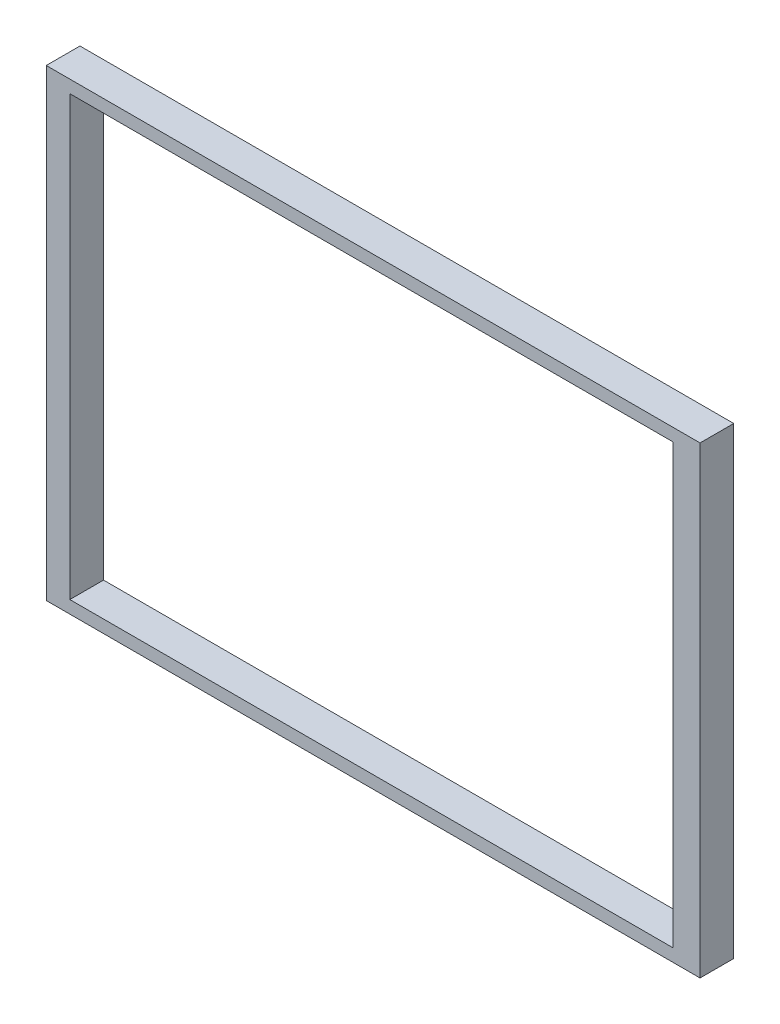
ISO-10303-21;
HEADER;
FILE_DESCRIPTION(('STEP AP214'),'2;1');
FILE_NAME('part.step','',(''),(''),'','','');
FILE_SCHEMA(('AUTOMOTIVE_DESIGN { 1 0 10303 214 1 1 1 1 }'));
ENDSEC;
DATA;
#1=APPLICATION_CONTEXT('core data for automotive mechanical design processes');
#2=APPLICATION_PROTOCOL_DEFINITION('international standard','automotive_design',2000,#1);
#3=PRODUCT_CONTEXT('',#1,'mechanical');
#4=PRODUCT('Part','Part','',(#3));
#5=PRODUCT_RELATED_PRODUCT_CATEGORY('part','',(#4));
#6=PRODUCT_DEFINITION_FORMATION('','',#4);
#7=PRODUCT_DEFINITION_CONTEXT('part definition',#1,'design');
#8=PRODUCT_DEFINITION('design','',#6,#7);
#9=PRODUCT_DEFINITION_SHAPE('','',#8);
#10=(LENGTH_UNIT() NAMED_UNIT(*) SI_UNIT(.MILLI.,.METRE.));
#11=(NAMED_UNIT(*) PLANE_ANGLE_UNIT() SI_UNIT($,.RADIAN.));
#12=(NAMED_UNIT(*) SI_UNIT($,.STERADIAN.) SOLID_ANGLE_UNIT());
#13=UNCERTAINTY_MEASURE_WITH_UNIT(LENGTH_MEASURE(1.E-05),#10,'distance_accuracy_value','');
#14=(GEOMETRIC_REPRESENTATION_CONTEXT(3) GLOBAL_UNCERTAINTY_ASSIGNED_CONTEXT((#13)) GLOBAL_UNIT_ASSIGNED_CONTEXT((#10,
#11,#12)) REPRESENTATION_CONTEXT('',''));
#15=CARTESIAN_POINT('',(0.,0.,0.));
#16=DIRECTION('',(0.,0.,1.));
#17=DIRECTION('',(1.,0.,0.));
#18=AXIS2_PLACEMENT_3D('',#15,#16,#17);
#19=CARTESIAN_POINT('',(0.,0.,4.));
#20=DIRECTION('',(0.,0.,1.));
#21=DIRECTION('',(1.,0.,0.));
#22=AXIS2_PLACEMENT_3D('',#19,#20,#21);
#23=PLANE('',#22);
#24=DIRECTION('',(0.,-1.,0.));
#25=VECTOR('',#24,1.);
#26=CARTESIAN_POINT('',(-37.7559939482542,31.8097014925373,4.));
#27=LINE('',#26,#25);
#28=CARTESIAN_POINT('',(-37.7559939482542,31.8097014925373,4.));
#29=VERTEX_POINT('',#28);
#30=CARTESIAN_POINT('',(-37.7559939482542,-23.1902985074627,4.));
#31=VERTEX_POINT('',#30);
#32=EDGE_CURVE('E157',#29,#31,#27,.T.);
#33=ORIENTED_EDGE('',*,*,#32,.T.);
#34=DIRECTION('',(1.,0.,0.));
#35=VECTOR('',#34,1.);
#36=CARTESIAN_POINT('',(-37.7559939482542,-23.1902985074627,4.));
#37=LINE('',#36,#35);
#38=CARTESIAN_POINT('',(39.8440060517458,-23.1902985074627,4.));
#39=VERTEX_POINT('',#38);
#40=EDGE_CURVE('E161',#31,#39,#37,.T.);
#41=ORIENTED_EDGE('',*,*,#40,.T.);
#42=DIRECTION('',(0.,1.,0.));
#43=VECTOR('',#42,1.);
#44=CARTESIAN_POINT('',(39.8440060517458,31.8097014925373,4.));
#45=LINE('',#44,#43);
#46=CARTESIAN_POINT('',(39.8440060517458,31.8097014925373,4.));
#47=VERTEX_POINT('',#46);
#48=EDGE_CURVE('E165',#39,#47,#45,.T.);
#49=ORIENTED_EDGE('',*,*,#48,.T.);
#50=DIRECTION('',(-1.,0.,0.));
#51=VECTOR('',#50,1.);
#52=CARTESIAN_POINT('',(-37.7559939482542,31.8097014925373,4.));
#53=LINE('',#52,#51);
#54=EDGE_CURVE('E168',#47,#29,#53,.T.);
#55=ORIENTED_EDGE('',*,*,#54,.T.);
#56=EDGE_LOOP('',(#33,#41,#49,#55));
#57=FACE_BOUND('',#56,.T.);
#58=DIRECTION('',(1.,0.,0.));
#59=VECTOR('',#58,1.);
#60=CARTESIAN_POINT('',(-34.9559939482542,-21.6902985074627,4.));
#61=LINE('',#60,#59);
#62=CARTESIAN_POINT('',(-34.9559939482542,-21.6902985074627,4.));
#63=VERTEX_POINT('',#62);
#64=CARTESIAN_POINT('',(36.6440060517458,-21.6902985074627,4.));
#65=VERTEX_POINT('',#64);
#66=EDGE_CURVE('E118',#63,#65,#61,.T.);
#67=ORIENTED_EDGE('',*,*,#66,.F.);
#68=DIRECTION('',(0.,-1.,0.));
#69=VECTOR('',#68,1.);
#70=CARTESIAN_POINT('',(-34.9559939482542,30.3097014925373,4.));
#71=LINE('',#70,#69);
#72=CARTESIAN_POINT('',(-34.9559939482542,30.3097014925373,4.));
#73=VERTEX_POINT('',#72);
#74=EDGE_CURVE('E109',#73,#63,#71,.T.);
#75=ORIENTED_EDGE('',*,*,#74,.F.);
#76=DIRECTION('',(-1.,0.,0.));
#77=VECTOR('',#76,1.);
#78=CARTESIAN_POINT('',(-34.9559939482542,30.3097014925373,4.));
#79=LINE('',#78,#77);
#80=CARTESIAN_POINT('',(36.6440060517458,30.3097014925373,4.));
#81=VERTEX_POINT('',#80);
#82=EDGE_CURVE('E135',#81,#73,#79,.T.);
#83=ORIENTED_EDGE('',*,*,#82,.F.);
#84=DIRECTION('',(0.,1.,0.));
#85=VECTOR('',#84,1.);
#86=CARTESIAN_POINT('',(36.6440060517458,30.3097014925373,4.));
#87=LINE('',#86,#85);
#88=EDGE_CURVE('E131',#65,#81,#87,.T.);
#89=ORIENTED_EDGE('',*,*,#88,.F.);
#90=EDGE_LOOP('',(#67,#75,#83,#89));
#91=FACE_BOUND('',#90,.T.);
#92=ADVANCED_FACE('F43',(#57,#91),#23,.T.);
#93=CARTESIAN_POINT('',(0.,0.,0.));
#94=DIRECTION('',(0.,0.,1.));
#95=DIRECTION('',(1.,0.,0.));
#96=AXIS2_PLACEMENT_3D('',#93,#94,#95);
#97=PLANE('',#96);
#98=DIRECTION('',(0.,-1.,0.));
#99=VECTOR('',#98,1.);
#100=CARTESIAN_POINT('',(-37.7559939482542,31.8097014925373,0.));
#101=LINE('',#100,#99);
#102=CARTESIAN_POINT('',(-37.7559939482542,31.8097014925373,0.));
#103=VERTEX_POINT('',#102);
#104=CARTESIAN_POINT('',(-37.7559939482542,-23.1902985074627,0.));
#105=VERTEX_POINT('',#104);
#106=EDGE_CURVE('E127',#103,#105,#101,.T.);
#107=ORIENTED_EDGE('',*,*,#106,.F.);
#108=DIRECTION('',(-1.,0.,0.));
#109=VECTOR('',#108,1.);
#110=CARTESIAN_POINT('',(-37.7559939482542,31.8097014925373,0.));
#111=LINE('',#110,#109);
#112=CARTESIAN_POINT('',(39.8440060517458,31.8097014925373,0.));
#113=VERTEX_POINT('',#112);
#114=EDGE_CURVE('E162',#113,#103,#111,.T.);
#115=ORIENTED_EDGE('',*,*,#114,.F.);
#116=DIRECTION('',(0.,1.,0.));
#117=VECTOR('',#116,1.);
#118=CARTESIAN_POINT('',(39.8440060517458,31.8097014925373,0.));
#119=LINE('',#118,#117);
#120=CARTESIAN_POINT('',(39.8440060517458,-23.1902985074627,0.));
#121=VERTEX_POINT('',#120);
#122=EDGE_CURVE('E178',#121,#113,#119,.T.);
#123=ORIENTED_EDGE('',*,*,#122,.F.);
#124=DIRECTION('',(1.,0.,0.));
#125=VECTOR('',#124,1.);
#126=CARTESIAN_POINT('',(-37.7559939482542,-23.1902985074627,0.));
#127=LINE('',#126,#125);
#128=EDGE_CURVE('E175',#105,#121,#127,.T.);
#129=ORIENTED_EDGE('',*,*,#128,.F.);
#130=EDGE_LOOP('',(#107,#115,#123,#129));
#131=FACE_BOUND('',#130,.T.);
#132=DIRECTION('',(0.,-1.,0.));
#133=VECTOR('',#132,1.);
#134=CARTESIAN_POINT('',(-34.9559939482542,30.3097014925373,0.));
#135=LINE('',#134,#133);
#136=CARTESIAN_POINT('',(-34.9559939482542,30.3097014925373,0.));
#137=VERTEX_POINT('',#136);
#138=CARTESIAN_POINT('',(-34.9559939482542,-21.6902985074627,0.));
#139=VERTEX_POINT('',#138);
#140=EDGE_CURVE('E67',#137,#139,#135,.T.);
#141=ORIENTED_EDGE('',*,*,#140,.T.);
#142=DIRECTION('',(1.,0.,0.));
#143=VECTOR('',#142,1.);
#144=CARTESIAN_POINT('',(-34.9559939482542,-21.6902985074627,0.));
#145=LINE('',#144,#143);
#146=CARTESIAN_POINT('',(36.6440060517458,-21.6902985074627,0.));
#147=VERTEX_POINT('',#146);
#148=EDGE_CURVE('E125',#139,#147,#145,.T.);
#149=ORIENTED_EDGE('',*,*,#148,.T.);
#150=DIRECTION('',(0.,1.,0.));
#151=VECTOR('',#150,1.);
#152=CARTESIAN_POINT('',(36.6440060517458,30.3097014925373,0.));
#153=LINE('',#152,#151);
#154=CARTESIAN_POINT('',(36.6440060517458,30.3097014925373,0.));
#155=VERTEX_POINT('',#154);
#156=EDGE_CURVE('E144',#147,#155,#153,.T.);
#157=ORIENTED_EDGE('',*,*,#156,.T.);
#158=DIRECTION('',(-1.,0.,0.));
#159=VECTOR('',#158,1.);
#160=CARTESIAN_POINT('',(-34.9559939482542,30.3097014925373,0.));
#161=LINE('',#160,#159);
#162=EDGE_CURVE('E119',#155,#137,#161,.T.);
#163=ORIENTED_EDGE('',*,*,#162,.T.);
#164=EDGE_LOOP('',(#141,#149,#157,#163));
#165=FACE_BOUND('',#164,.T.);
#166=ADVANCED_FACE('F201',(#131,#165),#97,.F.);
#167=CARTESIAN_POINT('',(-37.7559939482542,31.8097014925373,4.));
#168=DIRECTION('',(1.,0.,0.));
#169=DIRECTION('',(0.,1.,0.));
#170=AXIS2_PLACEMENT_3D('',#167,#168,#169);
#171=PLANE('',#170);
#172=ORIENTED_EDGE('',*,*,#106,.T.);
#173=DIRECTION('',(0.,0.,-1.));
#174=VECTOR('',#173,1.);
#175=CARTESIAN_POINT('',(-37.7559939482542,-23.1902985074627,4.));
#176=LINE('',#175,#174);
#177=EDGE_CURVE('E11',#31,#105,#176,.T.);
#178=ORIENTED_EDGE('',*,*,#177,.F.);
#179=ORIENTED_EDGE('',*,*,#32,.F.);
#180=DIRECTION('',(0.,0.,-1.));
#181=VECTOR('',#180,1.);
#182=CARTESIAN_POINT('',(-37.7559939482542,31.8097014925373,4.));
#183=LINE('',#182,#181);
#184=EDGE_CURVE('E171',#29,#103,#183,.T.);
#185=ORIENTED_EDGE('',*,*,#184,.T.);
#186=EDGE_LOOP('',(#172,#178,#179,#185));
#187=FACE_BOUND('',#186,.T.);
#188=ADVANCED_FACE('F45',(#187),#171,.F.);
#189=CARTESIAN_POINT('',(-37.7559939482542,-23.1902985074627,4.));
#190=DIRECTION('',(0.,1.,0.));
#191=DIRECTION('',(0.,0.,1.));
#192=AXIS2_PLACEMENT_3D('',#189,#190,#191);
#193=PLANE('',#192);
#194=ORIENTED_EDGE('',*,*,#128,.T.);
#195=DIRECTION('',(0.,0.,-1.));
#196=VECTOR('',#195,1.);
#197=CARTESIAN_POINT('',(39.8440060517458,-23.1902985074627,4.));
#198=LINE('',#197,#196);
#199=EDGE_CURVE('E52',#39,#121,#198,.T.);
#200=ORIENTED_EDGE('',*,*,#199,.F.);
#201=ORIENTED_EDGE('',*,*,#40,.F.);
#202=ORIENTED_EDGE('',*,*,#177,.T.);
#203=EDGE_LOOP('',(#194,#200,#201,#202));
#204=FACE_BOUND('',#203,.T.);
#205=ADVANCED_FACE('F211',(#204),#193,.F.);
#206=CARTESIAN_POINT('',(39.8440060517458,31.8097014925373,4.));
#207=DIRECTION('',(-1.,0.,0.));
#208=DIRECTION('',(0.,-1.,0.));
#209=AXIS2_PLACEMENT_3D('',#206,#207,#208);
#210=PLANE('',#209);
#211=ORIENTED_EDGE('',*,*,#122,.T.);
#212=DIRECTION('',(0.,0.,-1.));
#213=VECTOR('',#212,1.);
#214=CARTESIAN_POINT('',(39.8440060517458,31.8097014925373,4.));
#215=LINE('',#214,#213);
#216=EDGE_CURVE('E186',#47,#113,#215,.T.);
#217=ORIENTED_EDGE('',*,*,#216,.F.);
#218=ORIENTED_EDGE('',*,*,#48,.F.);
#219=ORIENTED_EDGE('',*,*,#199,.T.);
#220=EDGE_LOOP('',(#211,#217,#218,#219));
#221=FACE_BOUND('',#220,.T.);
#222=ADVANCED_FACE('F195',(#221),#210,.F.);
#223=CARTESIAN_POINT('',(-37.7559939482542,31.8097014925373,4.));
#224=DIRECTION('',(0.,-1.,0.));
#225=DIRECTION('',(0.,0.,-1.));
#226=AXIS2_PLACEMENT_3D('',#223,#224,#225);
#227=PLANE('',#226);
#228=ORIENTED_EDGE('',*,*,#114,.T.);
#229=ORIENTED_EDGE('',*,*,#184,.F.);
#230=ORIENTED_EDGE('',*,*,#54,.F.);
#231=ORIENTED_EDGE('',*,*,#216,.T.);
#232=EDGE_LOOP('',(#228,#229,#230,#231));
#233=FACE_BOUND('',#232,.T.);
#234=ADVANCED_FACE('F205',(#233),#227,.F.);
#235=CARTESIAN_POINT('',(-34.9559939482542,30.3097014925373,4.));
#236=DIRECTION('',(1.,0.,0.));
#237=DIRECTION('',(0.,1.,0.));
#238=AXIS2_PLACEMENT_3D('',#235,#236,#237);
#239=PLANE('',#238);
#240=ORIENTED_EDGE('',*,*,#140,.F.);
#241=DIRECTION('',(0.,0.,-1.));
#242=VECTOR('',#241,1.);
#243=CARTESIAN_POINT('',(-34.9559939482542,30.3097014925373,4.));
#244=LINE('',#243,#242);
#245=EDGE_CURVE('E113',#73,#137,#244,.T.);
#246=ORIENTED_EDGE('',*,*,#245,.F.);
#247=ORIENTED_EDGE('',*,*,#74,.T.);
#248=DIRECTION('',(0.,0.,-1.));
#249=VECTOR('',#248,1.);
#250=CARTESIAN_POINT('',(-34.9559939482542,-21.6902985074627,4.));
#251=LINE('',#250,#249);
#252=EDGE_CURVE('E112',#63,#139,#251,.T.);
#253=ORIENTED_EDGE('',*,*,#252,.T.);
#254=EDGE_LOOP('',(#240,#246,#247,#253));
#255=FACE_BOUND('',#254,.T.);
#256=ADVANCED_FACE('F111',(#255),#239,.T.);
#257=CARTESIAN_POINT('',(-34.9559939482542,-21.6902985074627,4.));
#258=DIRECTION('',(0.,1.,0.));
#259=DIRECTION('',(0.,0.,1.));
#260=AXIS2_PLACEMENT_3D('',#257,#258,#259);
#261=PLANE('',#260);
#262=ORIENTED_EDGE('',*,*,#148,.F.);
#263=ORIENTED_EDGE('',*,*,#252,.F.);
#264=ORIENTED_EDGE('',*,*,#66,.T.);
#265=DIRECTION('',(0.,0.,-1.));
#266=VECTOR('',#265,1.);
#267=CARTESIAN_POINT('',(36.6440060517458,-21.6902985074627,4.));
#268=LINE('',#267,#266);
#269=EDGE_CURVE('E128',#65,#147,#268,.T.);
#270=ORIENTED_EDGE('',*,*,#269,.T.);
#271=EDGE_LOOP('',(#262,#263,#264,#270));
#272=FACE_BOUND('',#271,.T.);
#273=ADVANCED_FACE('F122',(#272),#261,.T.);
#274=CARTESIAN_POINT('',(36.6440060517458,30.3097014925373,4.));
#275=DIRECTION('',(-1.,0.,0.));
#276=DIRECTION('',(0.,-1.,0.));
#277=AXIS2_PLACEMENT_3D('',#274,#275,#276);
#278=PLANE('',#277);
#279=ORIENTED_EDGE('',*,*,#156,.F.);
#280=ORIENTED_EDGE('',*,*,#269,.F.);
#281=ORIENTED_EDGE('',*,*,#88,.T.);
#282=DIRECTION('',(0.,0.,-1.));
#283=VECTOR('',#282,1.);
#284=CARTESIAN_POINT('',(36.6440060517458,30.3097014925373,4.));
#285=LINE('',#284,#283);
#286=EDGE_CURVE('E59',#81,#155,#285,.T.);
#287=ORIENTED_EDGE('',*,*,#286,.T.);
#288=EDGE_LOOP('',(#279,#280,#281,#287));
#289=FACE_BOUND('',#288,.T.);
#290=ADVANCED_FACE('F234',(#289),#278,.T.);
#291=CARTESIAN_POINT('',(-34.9559939482542,30.3097014925373,4.));
#292=DIRECTION('',(0.,-1.,0.));
#293=DIRECTION('',(1.,0.,0.));
#294=AXIS2_PLACEMENT_3D('',#291,#292,#293);
#295=PLANE('',#294);
#296=ORIENTED_EDGE('',*,*,#162,.F.);
#297=ORIENTED_EDGE('',*,*,#286,.F.);
#298=ORIENTED_EDGE('',*,*,#82,.T.);
#299=ORIENTED_EDGE('',*,*,#245,.T.);
#300=EDGE_LOOP('',(#296,#297,#298,#299));
#301=FACE_BOUND('',#300,.T.);
#302=ADVANCED_FACE('F238',(#301),#295,.T.);
#303=CLOSED_SHELL('',(#92,#166,#188,#205,#222,#234,#256,#273,#290,#302));
#304=MANIFOLD_SOLID_BREP('B2',#303);
#305=ADVANCED_BREP_SHAPE_REPRESENTATION('',(#18,#304),#14);
#306=SHAPE_DEFINITION_REPRESENTATION(#9,#305);
ENDSEC;
END-ISO-10303-21;
